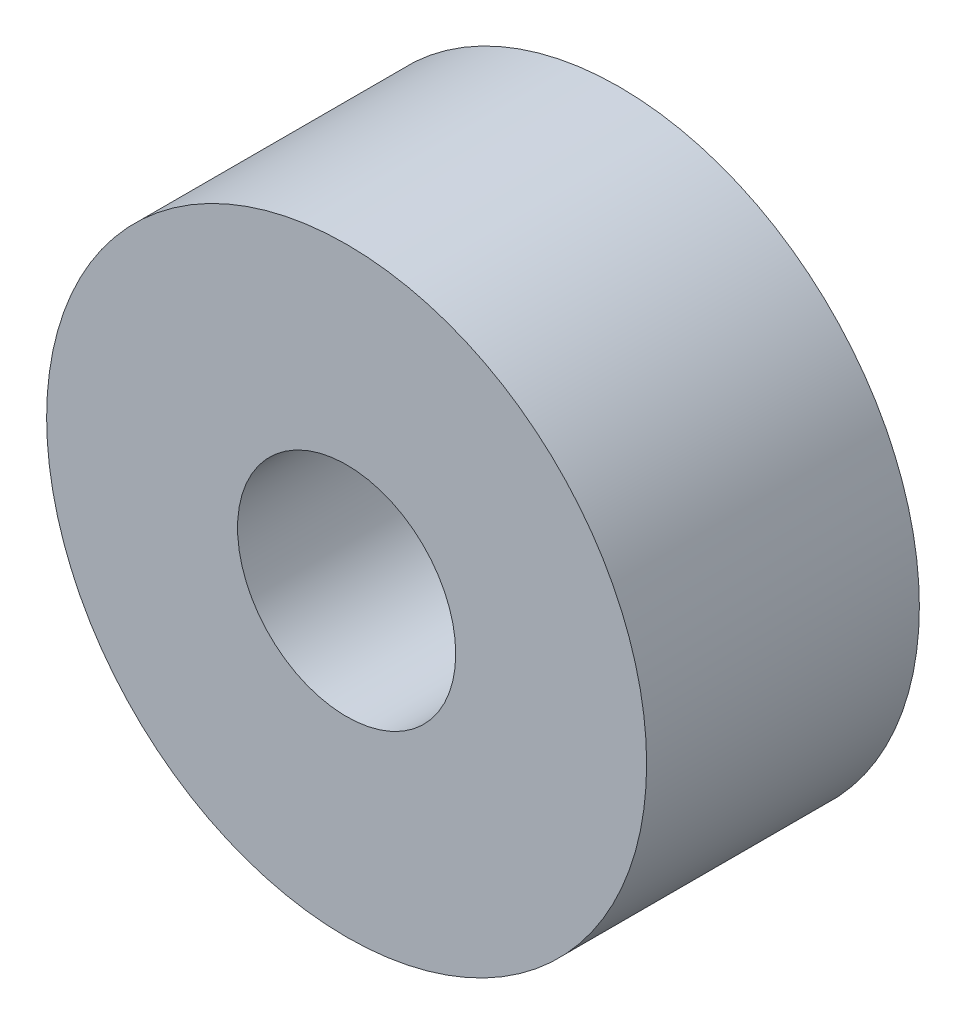
ISO-10303-21;
HEADER;
FILE_DESCRIPTION(('STEP AP214'),'2;1');
FILE_NAME('part.step','',(''),(''),'','','');
FILE_SCHEMA(('AUTOMOTIVE_DESIGN { 1 0 10303 214 1 1 1 1 }'));
ENDSEC;
DATA;
#1=APPLICATION_CONTEXT('core data for automotive mechanical design processes');
#2=APPLICATION_PROTOCOL_DEFINITION('international standard','automotive_design',2000,#1);
#3=PRODUCT_CONTEXT('',#1,'mechanical');
#4=PRODUCT('Part','Part','',(#3));
#5=PRODUCT_RELATED_PRODUCT_CATEGORY('part','',(#4));
#6=PRODUCT_DEFINITION_FORMATION('','',#4);
#7=PRODUCT_DEFINITION_CONTEXT('part definition',#1,'design');
#8=PRODUCT_DEFINITION('design','',#6,#7);
#9=PRODUCT_DEFINITION_SHAPE('','',#8);
#10=(LENGTH_UNIT() NAMED_UNIT(*) SI_UNIT(.MILLI.,.METRE.));
#11=(NAMED_UNIT(*) PLANE_ANGLE_UNIT() SI_UNIT($,.RADIAN.));
#12=(NAMED_UNIT(*) SI_UNIT($,.STERADIAN.) SOLID_ANGLE_UNIT());
#13=UNCERTAINTY_MEASURE_WITH_UNIT(LENGTH_MEASURE(1.E-05),#10,'distance_accuracy_value','');
#14=(GEOMETRIC_REPRESENTATION_CONTEXT(3) GLOBAL_UNCERTAINTY_ASSIGNED_CONTEXT((#13)) GLOBAL_UNIT_ASSIGNED_CONTEXT((#10,
#11,#12)) REPRESENTATION_CONTEXT('',''));
#15=CARTESIAN_POINT('',(0.,0.,0.));
#16=DIRECTION('',(0.,0.,1.));
#17=DIRECTION('',(1.,0.,0.));
#18=AXIS2_PLACEMENT_3D('',#15,#16,#17);
#19=CARTESIAN_POINT('',(0.,0.,10.));
#20=DIRECTION('',(0.,0.,1.));
#21=DIRECTION('',(1.,0.,0.));
#22=AXIS2_PLACEMENT_3D('',#19,#20,#21);
#23=PLANE('',#22);
#24=CARTESIAN_POINT('',(0.,0.,10.));
#25=DIRECTION('',(0.,0.,1.));
#26=DIRECTION('',(1.,0.,0.));
#27=AXIS2_PLACEMENT_3D('',#24,#25,#26);
#28=CIRCLE('',#27,11.);
#29=CARTESIAN_POINT('',(11.,0.,10.));
#30=VERTEX_POINT('',#29);
#31=EDGE_CURVE('E10',#30,#30,#28,.T.);
#32=ORIENTED_EDGE('',*,*,#31,.T.);
#33=EDGE_LOOP('',(#32));
#34=FACE_BOUND('',#33,.T.);
#35=CARTESIAN_POINT('',(0.,0.,10.));
#36=DIRECTION('',(0.,0.,1.));
#37=DIRECTION('',(1.,0.,0.));
#38=AXIS2_PLACEMENT_3D('',#35,#36,#37);
#39=CIRCLE('',#38,4.);
#40=CARTESIAN_POINT('',(4.,0.,10.));
#41=VERTEX_POINT('',#40);
#42=EDGE_CURVE('E44',#41,#41,#39,.T.);
#43=ORIENTED_EDGE('',*,*,#42,.F.);
#44=EDGE_LOOP('',(#43));
#45=FACE_BOUND('',#44,.T.);
#46=ADVANCED_FACE('F33',(#34,#45),#23,.T.);
#47=CARTESIAN_POINT('',(0.,0.,0.));
#48=DIRECTION('',(0.,0.,1.));
#49=DIRECTION('',(1.,0.,0.));
#50=AXIS2_PLACEMENT_3D('',#47,#48,#49);
#51=PLANE('',#50);
#52=CARTESIAN_POINT('',(0.,0.,0.));
#53=DIRECTION('',(0.,0.,1.));
#54=DIRECTION('',(1.,0.,0.));
#55=AXIS2_PLACEMENT_3D('',#52,#53,#54);
#56=CIRCLE('',#55,11.);
#57=CARTESIAN_POINT('',(11.,0.,0.));
#58=VERTEX_POINT('',#57);
#59=EDGE_CURVE('E37',#58,#58,#56,.T.);
#60=ORIENTED_EDGE('',*,*,#59,.F.);
#61=EDGE_LOOP('',(#60));
#62=FACE_BOUND('',#61,.T.);
#63=CARTESIAN_POINT('',(0.,0.,0.));
#64=DIRECTION('',(0.,0.,1.));
#65=DIRECTION('',(1.,0.,0.));
#66=AXIS2_PLACEMENT_3D('',#63,#64,#65);
#67=CIRCLE('',#66,4.);
#68=CARTESIAN_POINT('',(4.,0.,0.));
#69=VERTEX_POINT('',#68);
#70=EDGE_CURVE('E46',#69,#69,#67,.T.);
#71=ORIENTED_EDGE('',*,*,#70,.T.);
#72=EDGE_LOOP('',(#71));
#73=FACE_BOUND('',#72,.T.);
#74=ADVANCED_FACE('F56',(#62,#73),#51,.F.);
#75=CARTESIAN_POINT('',(0.,0.,10.));
#76=DIRECTION('',(0.,0.,-1.));
#77=DIRECTION('',(-1.,0.,0.));
#78=AXIS2_PLACEMENT_3D('',#75,#76,#77);
#79=CYLINDRICAL_SURFACE('',#78,11.);
#80=ORIENTED_EDGE('',*,*,#31,.F.);
#81=EDGE_LOOP('',(#80));
#82=FACE_BOUND('',#81,.T.);
#83=ORIENTED_EDGE('',*,*,#59,.T.);
#84=EDGE_LOOP('',(#83));
#85=FACE_BOUND('',#84,.T.);
#86=ADVANCED_FACE('F35',(#82,#85),#79,.T.);
#87=CARTESIAN_POINT('',(0.,0.,10.));
#88=DIRECTION('',(0.,0.,-1.));
#89=DIRECTION('',(-1.,0.,0.));
#90=AXIS2_PLACEMENT_3D('',#87,#88,#89);
#91=CYLINDRICAL_SURFACE('',#90,4.);
#92=ORIENTED_EDGE('',*,*,#42,.T.);
#93=EDGE_LOOP('',(#92));
#94=FACE_BOUND('',#93,.T.);
#95=ORIENTED_EDGE('',*,*,#70,.F.);
#96=EDGE_LOOP('',(#95));
#97=FACE_BOUND('',#96,.T.);
#98=ADVANCED_FACE('F52',(#94,#97),#91,.F.);
#99=CLOSED_SHELL('',(#46,#74,#86,#98));
#100=MANIFOLD_SOLID_BREP('B2',#99);
#101=ADVANCED_BREP_SHAPE_REPRESENTATION('',(#18,#100),#14);
#102=SHAPE_DEFINITION_REPRESENTATION(#9,#101);
ENDSEC;
END-ISO-10303-21;
